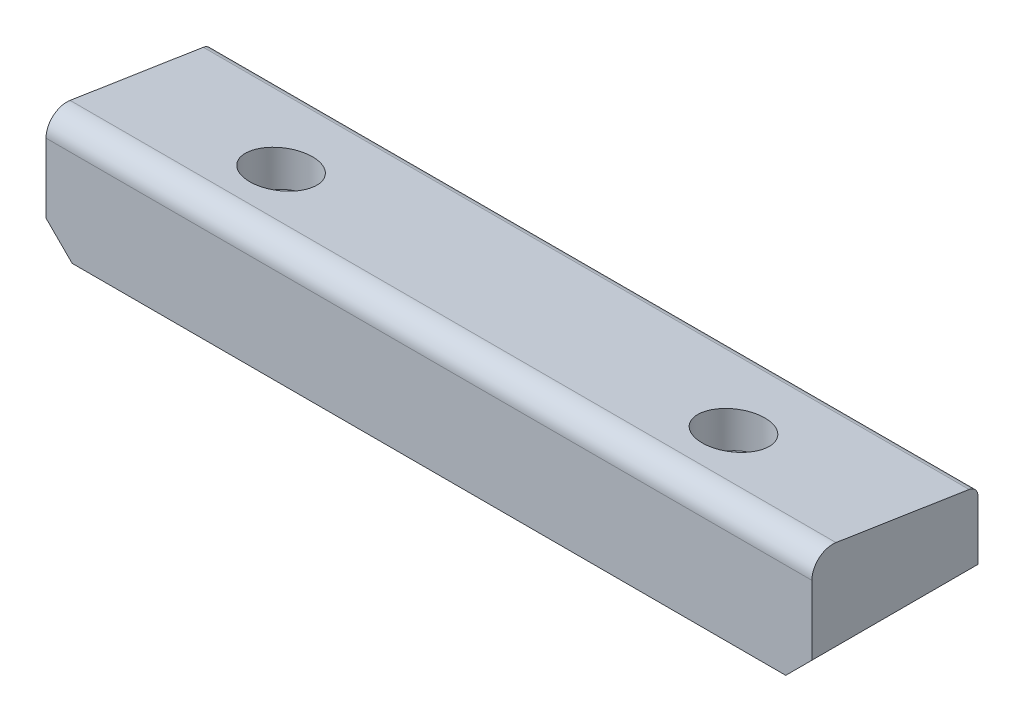
ISO-10303-21;
HEADER;
FILE_DESCRIPTION(('STEP AP214'),'2;1');
FILE_NAME('part.step','',(''),(''),'','','');
FILE_SCHEMA(('AUTOMOTIVE_DESIGN { 1 0 10303 214 1 1 1 1 }'));
ENDSEC;
DATA;
#1=APPLICATION_CONTEXT('core data for automotive mechanical design processes');
#2=APPLICATION_PROTOCOL_DEFINITION('international standard','automotive_design',2000,#1);
#3=PRODUCT_CONTEXT('',#1,'mechanical');
#4=PRODUCT('Part','Part','',(#3));
#5=PRODUCT_RELATED_PRODUCT_CATEGORY('part','',(#4));
#6=PRODUCT_DEFINITION_FORMATION('','',#4);
#7=PRODUCT_DEFINITION_CONTEXT('part definition',#1,'design');
#8=PRODUCT_DEFINITION('design','',#6,#7);
#9=PRODUCT_DEFINITION_SHAPE('','',#8);
#10=(LENGTH_UNIT() NAMED_UNIT(*) SI_UNIT(.MILLI.,.METRE.));
#11=(NAMED_UNIT(*) PLANE_ANGLE_UNIT() SI_UNIT($,.RADIAN.));
#12=(NAMED_UNIT(*) SI_UNIT($,.STERADIAN.) SOLID_ANGLE_UNIT());
#13=UNCERTAINTY_MEASURE_WITH_UNIT(LENGTH_MEASURE(1.E-05),#10,'distance_accuracy_value','');
#14=(GEOMETRIC_REPRESENTATION_CONTEXT(3) GLOBAL_UNCERTAINTY_ASSIGNED_CONTEXT((#13)) GLOBAL_UNIT_ASSIGNED_CONTEXT((#10,
#11,#12)) REPRESENTATION_CONTEXT('',''));
#15=CARTESIAN_POINT('',(0.,0.,0.));
#16=DIRECTION('',(0.,0.,1.));
#17=DIRECTION('',(1.,0.,0.));
#18=AXIS2_PLACEMENT_3D('',#15,#16,#17);
#19=CARTESIAN_POINT('',(36.65,5.73063892415449,9.55));
#20=DIRECTION('',(1.,0.,0.));
#21=DIRECTION('',(0.,1.,0.));
#22=AXIS2_PLACEMENT_3D('',#19,#20,#21);
#23=PLANE('',#22);
#24=DIRECTION('',(0.,0.,1.));
#25=VECTOR('',#24,1.);
#26=CARTESIAN_POINT('',(36.65,2.5,13.525));
#27=LINE('',#26,#25);
#28=CARTESIAN_POINT('',(36.65,2.5,1.6));
#29=VERTEX_POINT('',#28);
#30=CARTESIAN_POINT('',(36.65,2.5,17.5));
#31=VERTEX_POINT('',#30);
#32=EDGE_CURVE('E163',#29,#31,#27,.T.);
#33=ORIENTED_EDGE('',*,*,#32,.F.);
#34=DIRECTION('',(0.,1.,0.));
#35=VECTOR('',#34,1.);
#36=CARTESIAN_POINT('',(36.65,0.,1.6));
#37=LINE('',#36,#35);
#38=CARTESIAN_POINT('',(36.65,8.1447868426118,1.6));
#39=VERTEX_POINT('',#38);
#40=EDGE_CURVE('E160',#29,#39,#37,.T.);
#41=ORIENTED_EDGE('',*,*,#40,.T.);
#42=CARTESIAN_POINT('',(36.65,8.1447868426118,2.6));
#43=DIRECTION('',(-1.,0.,0.));
#44=DIRECTION('',(0.,0.650825020832891,-0.759227760463135));
#45=AXIS2_PLACEMENT_3D('',#42,#43,#44);
#46=CIRCLE('',#45,1.);
#47=CARTESIAN_POINT('',(36.65,9.13303568865246,2.44714641548425));
#48=VERTEX_POINT('',#47);
#49=EDGE_CURVE('E278',#48,#39,#46,.T.);
#50=ORIENTED_EDGE('',*,*,#49,.F.);
#51=DIRECTION('',(0.,0.152853584515735,0.988248846040657));
#52=VECTOR('',#51,1.);
#53=CARTESIAN_POINT('',(36.65,9.00200657919767,1.6));
#54=LINE('',#53,#52);
#55=CARTESIAN_POINT('',(36.65,11.1046514712157,15.1942928309685));
#56=VERTEX_POINT('',#55);
#57=EDGE_CURVE('E247',#48,#56,#54,.T.);
#58=ORIENTED_EDGE('',*,*,#57,.T.);
#59=CARTESIAN_POINT('',(36.65,9.12815377913439,15.5));
#60=DIRECTION('',(-1.,0.,0.));
#61=DIRECTION('',(0.,0.759227760463135,0.650825020832891));
#62=AXIS2_PLACEMENT_3D('',#59,#60,#61);
#63=CIRCLE('',#62,2.);
#64=CARTESIAN_POINT('',(36.65,9.12815377913439,17.5));
#65=VERTEX_POINT('',#64);
#66=EDGE_CURVE('E222',#65,#56,#63,.T.);
#67=ORIENTED_EDGE('',*,*,#66,.F.);
#68=DIRECTION('',(0.,-1.,0.));
#69=VECTOR('',#68,1.);
#70=CARTESIAN_POINT('',(36.65,0.,17.5));
#71=LINE('',#70,#69);
#72=EDGE_CURVE('E37',#65,#31,#71,.T.);
#73=ORIENTED_EDGE('',*,*,#72,.T.);
#74=EDGE_LOOP('',(#33,#41,#50,#58,#67,#73));
#75=FACE_BOUND('',#74,.T.);
#76=ADVANCED_FACE('F17',(#75),#23,.T.);
#77=CARTESIAN_POINT('',(21.65,50.,10.));
#78=DIRECTION('',(0.,1.,0.));
#79=DIRECTION('',(0.,0.,-1.));
#80=AXIS2_PLACEMENT_3D('',#77,#78,#79);
#81=CYLINDRICAL_SURFACE('',#80,1.6);
#82=CARTESIAN_POINT('',(21.65,6.5,10.));
#83=DIRECTION('',(0.,1.,0.));
#84=DIRECTION('',(0.,0.,-1.));
#85=AXIS2_PLACEMENT_3D('',#82,#83,#84);
#86=CIRCLE('',#85,1.6);
#87=CARTESIAN_POINT('',(21.65,6.5,8.4));
#88=VERTEX_POINT('',#87);
#89=EDGE_CURVE('E11',#88,#88,#86,.T.);
#90=ORIENTED_EDGE('',*,*,#89,.T.);
#91=EDGE_LOOP('',(#90));
#92=FACE_BOUND('',#91,.T.);
#93=CARTESIAN_POINT('',(21.65,0.,10.));
#94=DIRECTION('',(0.,1.,0.));
#95=DIRECTION('',(0.,0.,-1.));
#96=AXIS2_PLACEMENT_3D('',#93,#94,#95);
#97=CIRCLE('',#96,1.6);
#98=CARTESIAN_POINT('',(21.65,0.,8.4));
#99=VERTEX_POINT('',#98);
#100=EDGE_CURVE('E242',#99,#99,#97,.T.);
#101=ORIENTED_EDGE('',*,*,#100,.F.);
#102=EDGE_LOOP('',(#101));
#103=FACE_BOUND('',#102,.T.);
#104=ADVANCED_FACE('F335',(#92,#103),#81,.F.);
#105=CARTESIAN_POINT('',(-21.65,50.,10.));
#106=DIRECTION('',(0.,1.,0.));
#107=DIRECTION('',(0.,0.,-1.));
#108=AXIS2_PLACEMENT_3D('',#105,#106,#107);
#109=CYLINDRICAL_SURFACE('',#108,1.6);
#110=CARTESIAN_POINT('',(-21.65,6.5,10.));
#111=DIRECTION('',(0.,1.,0.));
#112=DIRECTION('',(0.,0.,-1.));
#113=AXIS2_PLACEMENT_3D('',#110,#111,#112);
#114=CIRCLE('',#113,1.6);
#115=CARTESIAN_POINT('',(-21.65,6.5,8.4));
#116=VERTEX_POINT('',#115);
#117=EDGE_CURVE('E311',#116,#116,#114,.T.);
#118=ORIENTED_EDGE('',*,*,#117,.T.);
#119=EDGE_LOOP('',(#118));
#120=FACE_BOUND('',#119,.T.);
#121=CARTESIAN_POINT('',(-21.65,0.,10.));
#122=DIRECTION('',(0.,1.,0.));
#123=DIRECTION('',(0.,0.,-1.));
#124=AXIS2_PLACEMENT_3D('',#121,#122,#123);
#125=CIRCLE('',#124,1.6);
#126=CARTESIAN_POINT('',(-21.65,0.,8.4));
#127=VERTEX_POINT('',#126);
#128=EDGE_CURVE('E238',#127,#127,#125,.T.);
#129=ORIENTED_EDGE('',*,*,#128,.F.);
#130=EDGE_LOOP('',(#129));
#131=FACE_BOUND('',#130,.T.);
#132=ADVANCED_FACE('F324',(#120,#131),#109,.F.);
#133=CARTESIAN_POINT('',(21.65,6.5,10.));
#134=DIRECTION('',(0.,-1.,0.));
#135=DIRECTION('',(0.,0.,-1.));
#136=AXIS2_PLACEMENT_3D('',#133,#134,#135);
#137=PLANE('',#136);
#138=ORIENTED_EDGE('',*,*,#89,.F.);
#139=EDGE_LOOP('',(#138));
#140=FACE_BOUND('',#139,.T.);
#141=CARTESIAN_POINT('',(21.65,6.5,10.));
#142=DIRECTION('',(0.,-1.,0.));
#143=DIRECTION('',(1.,0.,0.));
#144=AXIS2_PLACEMENT_3D('',#141,#142,#143);
#145=CIRCLE('',#144,3.);
#146=CARTESIAN_POINT('',(24.65,6.5,10.));
#147=VERTEX_POINT('',#146);
#148=EDGE_CURVE('E25',#147,#147,#145,.T.);
#149=ORIENTED_EDGE('',*,*,#148,.F.);
#150=EDGE_LOOP('',(#149));
#151=FACE_BOUND('',#150,.T.);
#152=ADVANCED_FACE('F322',(#140,#151),#137,.F.);
#153=CARTESIAN_POINT('',(21.65,6.5,10.));
#154=DIRECTION('',(0.,1.,0.));
#155=DIRECTION('',(1.,0.,0.));
#156=AXIS2_PLACEMENT_3D('',#153,#154,#155);
#157=CYLINDRICAL_SURFACE('',#156,3.);
#158=CARTESIAN_POINT('',(21.65,10.3012442308036,10.));
#159=DIRECTION('',(0.,-0.988248846040657,0.152853584515735));
#160=DIRECTION('',(0.,-0.152853584515735,-0.988248846040657));
#161=AXIS2_PLACEMENT_3D('',#158,#159,#160);
#162=ELLIPSE('',#161,3.03567265675975,3.);
#163=CARTESIAN_POINT('',(21.65,9.83723078380147,7.));
#164=VERTEX_POINT('',#163);
#165=EDGE_CURVE('E289',#164,#164,#162,.T.);
#166=ORIENTED_EDGE('',*,*,#165,.F.);
#167=EDGE_LOOP('',(#166));
#168=FACE_BOUND('',#167,.T.);
#169=ORIENTED_EDGE('',*,*,#148,.T.);
#170=EDGE_LOOP('',(#169));
#171=FACE_BOUND('',#170,.T.);
#172=ADVANCED_FACE('F320',(#168,#171),#157,.F.);
#173=CARTESIAN_POINT('',(-21.65,6.5,10.));
#174=DIRECTION('',(0.,-1.,0.));
#175=DIRECTION('',(0.,0.,-1.));
#176=AXIS2_PLACEMENT_3D('',#173,#174,#175);
#177=PLANE('',#176);
#178=ORIENTED_EDGE('',*,*,#117,.F.);
#179=EDGE_LOOP('',(#178));
#180=FACE_BOUND('',#179,.T.);
#181=CARTESIAN_POINT('',(-21.65,6.5,10.));
#182=DIRECTION('',(0.,-1.,0.));
#183=DIRECTION('',(1.,0.,0.));
#184=AXIS2_PLACEMENT_3D('',#181,#182,#183);
#185=CIRCLE('',#184,3.);
#186=CARTESIAN_POINT('',(-18.65,6.5,10.));
#187=VERTEX_POINT('',#186);
#188=EDGE_CURVE('E307',#187,#187,#185,.T.);
#189=ORIENTED_EDGE('',*,*,#188,.F.);
#190=EDGE_LOOP('',(#189));
#191=FACE_BOUND('',#190,.T.);
#192=ADVANCED_FACE('F332',(#180,#191),#177,.F.);
#193=CARTESIAN_POINT('',(-21.65,6.5,10.));
#194=DIRECTION('',(0.,1.,0.));
#195=DIRECTION('',(1.,0.,0.));
#196=AXIS2_PLACEMENT_3D('',#193,#194,#195);
#197=CYLINDRICAL_SURFACE('',#196,3.);
#198=CARTESIAN_POINT('',(-21.65,10.3012442308036,10.));
#199=DIRECTION('',(0.,-0.988248846040657,0.152853584515735));
#200=DIRECTION('',(0.,-0.152853584515735,-0.988248846040657));
#201=AXIS2_PLACEMENT_3D('',#198,#199,#200);
#202=ELLIPSE('',#201,3.03567265675975,3.);
#203=CARTESIAN_POINT('',(-21.65,9.83723078380147,7.));
#204=VERTEX_POINT('',#203);
#205=EDGE_CURVE('E293',#204,#204,#202,.T.);
#206=ORIENTED_EDGE('',*,*,#205,.F.);
#207=EDGE_LOOP('',(#206));
#208=FACE_BOUND('',#207,.T.);
#209=ORIENTED_EDGE('',*,*,#188,.T.);
#210=EDGE_LOOP('',(#209));
#211=FACE_BOUND('',#210,.T.);
#212=ADVANCED_FACE('F410',(#208,#211),#197,.F.);
#213=CARTESIAN_POINT('',(0.,11.461277848309,17.5));
#214=DIRECTION('',(0.,0.,1.));
#215=DIRECTION('',(1.,0.,0.));
#216=AXIS2_PLACEMENT_3D('',#213,#214,#215);
#217=PLANE('',#216);
#218=DIRECTION('',(-0.707106781186548,-0.707106781186548,0.));
#219=VECTOR('',#218,1.);
#220=CARTESIAN_POINT('',(29.1028194620772,-5.04718053792275,17.5));
#221=LINE('',#220,#219);
#222=CARTESIAN_POINT('',(34.15,0.,17.5));
#223=VERTEX_POINT('',#222);
#224=EDGE_CURVE('E154',#31,#223,#221,.T.);
#225=ORIENTED_EDGE('',*,*,#224,.F.);
#226=ORIENTED_EDGE('',*,*,#72,.F.);
#227=DIRECTION('',(1.,0.,0.));
#228=VECTOR('',#227,1.);
#229=CARTESIAN_POINT('',(0.,9.12815377913439,17.5));
#230=LINE('',#229,#228);
#231=CARTESIAN_POINT('',(-36.65,9.12815377913439,17.5));
#232=VERTEX_POINT('',#231);
#233=EDGE_CURVE('E43',#232,#65,#230,.T.);
#234=ORIENTED_EDGE('',*,*,#233,.F.);
#235=DIRECTION('',(0.,1.,0.));
#236=VECTOR('',#235,1.);
#237=CARTESIAN_POINT('',(-36.65,0.,17.5));
#238=LINE('',#237,#236);
#239=CARTESIAN_POINT('',(-36.65,2.5,17.5));
#240=VERTEX_POINT('',#239);
#241=EDGE_CURVE('E297',#240,#232,#238,.T.);
#242=ORIENTED_EDGE('',*,*,#241,.F.);
#243=DIRECTION('',(-0.707106781186548,0.707106781186548,0.));
#244=VECTOR('',#243,1.);
#245=CARTESIAN_POINT('',(-29.1028194620772,-5.04718053792275,17.5));
#246=LINE('',#245,#244);
#247=CARTESIAN_POINT('',(-34.15,0.,17.5));
#248=VERTEX_POINT('',#247);
#249=EDGE_CURVE('E258',#248,#240,#246,.T.);
#250=ORIENTED_EDGE('',*,*,#249,.F.);
#251=DIRECTION('',(-1.,0.,0.));
#252=VECTOR('',#251,1.);
#253=CARTESIAN_POINT('',(0.,0.,17.5));
#254=LINE('',#253,#252);
#255=EDGE_CURVE('E214',#223,#248,#254,.T.);
#256=ORIENTED_EDGE('',*,*,#255,.F.);
#257=EDGE_LOOP('',(#225,#226,#234,#242,#250,#256));
#258=FACE_BOUND('',#257,.T.);
#259=ADVANCED_FACE('F347',(#258),#217,.T.);
#260=CARTESIAN_POINT('',(0.,9.12815377913439,15.5));
#261=DIRECTION('',(1.,0.,0.));
#262=DIRECTION('',(0.,0.759227760463135,0.650825020832891));
#263=AXIS2_PLACEMENT_3D('',#260,#261,#262);
#264=CYLINDRICAL_SURFACE('',#263,2.);
#265=ORIENTED_EDGE('',*,*,#66,.T.);
#266=DIRECTION('',(-1.,0.,0.));
#267=VECTOR('',#266,1.);
#268=CARTESIAN_POINT('',(0.,11.1046514712157,15.1942928309685));
#269=LINE('',#268,#267);
#270=CARTESIAN_POINT('',(-36.65,11.1046514712157,15.1942928309685));
#271=VERTEX_POINT('',#270);
#272=EDGE_CURVE('E243',#56,#271,#269,.T.);
#273=ORIENTED_EDGE('',*,*,#272,.T.);
#274=CARTESIAN_POINT('',(-36.65,9.12815377913439,15.5));
#275=DIRECTION('',(1.,0.,0.));
#276=DIRECTION('',(0.,0.759227760463135,0.650825020832891));
#277=AXIS2_PLACEMENT_3D('',#274,#275,#276);
#278=CIRCLE('',#277,2.);
#279=EDGE_CURVE('E225',#271,#232,#278,.T.);
#280=ORIENTED_EDGE('',*,*,#279,.T.);
#281=ORIENTED_EDGE('',*,*,#233,.T.);
#282=EDGE_LOOP('',(#265,#273,#280,#281));
#283=FACE_BOUND('',#282,.T.);
#284=ADVANCED_FACE('F388',(#283),#264,.T.);
#285=CARTESIAN_POINT('',(-36.65,5.73063892415449,9.55));
#286=DIRECTION('',(-1.,0.,0.));
#287=DIRECTION('',(0.,0.,1.));
#288=AXIS2_PLACEMENT_3D('',#285,#286,#287);
#289=PLANE('',#288);
#290=DIRECTION('',(0.,0.,-1.));
#291=VECTOR('',#290,1.);
#292=CARTESIAN_POINT('',(-36.65,2.5,13.525));
#293=LINE('',#292,#291);
#294=CARTESIAN_POINT('',(-36.65,2.5,1.6));
#295=VERTEX_POINT('',#294);
#296=EDGE_CURVE('E254',#240,#295,#293,.T.);
#297=ORIENTED_EDGE('',*,*,#296,.F.);
#298=ORIENTED_EDGE('',*,*,#241,.T.);
#299=ORIENTED_EDGE('',*,*,#279,.F.);
#300=DIRECTION('',(0.,-0.152853584515735,-0.988248846040657));
#301=VECTOR('',#300,1.);
#302=CARTESIAN_POINT('',(-36.65,9.00200657919767,1.6));
#303=LINE('',#302,#301);
#304=CARTESIAN_POINT('',(-36.65,9.13303568865246,2.44714641548425));
#305=VERTEX_POINT('',#304);
#306=EDGE_CURVE('E248',#271,#305,#303,.T.);
#307=ORIENTED_EDGE('',*,*,#306,.T.);
#308=CARTESIAN_POINT('',(-36.65,8.1447868426118,2.6));
#309=DIRECTION('',(1.,0.,0.));
#310=DIRECTION('',(0.,0.650825020832891,-0.759227760463135));
#311=AXIS2_PLACEMENT_3D('',#308,#309,#310);
#312=CIRCLE('',#311,1.);
#313=CARTESIAN_POINT('',(-36.65,8.1447868426118,1.6));
#314=VERTEX_POINT('',#313);
#315=EDGE_CURVE('E272',#314,#305,#312,.T.);
#316=ORIENTED_EDGE('',*,*,#315,.F.);
#317=DIRECTION('',(0.,-1.,0.));
#318=VECTOR('',#317,1.);
#319=CARTESIAN_POINT('',(-36.65,0.,1.6));
#320=LINE('',#319,#318);
#321=EDGE_CURVE('E204',#314,#295,#320,.T.);
#322=ORIENTED_EDGE('',*,*,#321,.T.);
#323=EDGE_LOOP('',(#297,#298,#299,#307,#316,#322));
#324=FACE_BOUND('',#323,.T.);
#325=ADVANCED_FACE('F384',(#324),#289,.T.);
#326=CARTESIAN_POINT('',(0.,9.00200657919767,1.6));
#327=DIRECTION('',(0.,0.988248846040657,-0.152853584515735));
#328=DIRECTION('',(-1.,0.,0.));
#329=AXIS2_PLACEMENT_3D('',#326,#327,#328);
#330=PLANE('',#329);
#331=ORIENTED_EDGE('',*,*,#205,.T.);
#332=EDGE_LOOP('',(#331));
#333=FACE_BOUND('',#332,.T.);
#334=ORIENTED_EDGE('',*,*,#165,.T.);
#335=EDGE_LOOP('',(#334));
#336=FACE_BOUND('',#335,.T.);
#337=DIRECTION('',(1.,0.,0.));
#338=VECTOR('',#337,1.);
#339=CARTESIAN_POINT('',(0.,9.13303568865246,2.44714641548425));
#340=LINE('',#339,#338);
#341=EDGE_CURVE('E268',#305,#48,#340,.T.);
#342=ORIENTED_EDGE('',*,*,#341,.F.);
#343=ORIENTED_EDGE('',*,*,#306,.F.);
#344=ORIENTED_EDGE('',*,*,#272,.F.);
#345=ORIENTED_EDGE('',*,*,#57,.F.);
#346=EDGE_LOOP('',(#342,#343,#344,#345));
#347=FACE_BOUND('',#346,.T.);
#348=ADVANCED_FACE('F387',(#333,#336,#347),#330,.T.);
#349=CARTESIAN_POINT('',(0.,8.1447868426118,2.6));
#350=DIRECTION('',(1.,0.,0.));
#351=DIRECTION('',(0.,0.650825020832891,-0.759227760463135));
#352=AXIS2_PLACEMENT_3D('',#349,#350,#351);
#353=CYLINDRICAL_SURFACE('',#352,1.);
#354=ORIENTED_EDGE('',*,*,#49,.T.);
#355=DIRECTION('',(-1.,0.,0.));
#356=VECTOR('',#355,1.);
#357=CARTESIAN_POINT('',(0.,8.1447868426118,1.6));
#358=LINE('',#357,#356);
#359=EDGE_CURVE('E208',#39,#314,#358,.T.);
#360=ORIENTED_EDGE('',*,*,#359,.T.);
#361=ORIENTED_EDGE('',*,*,#315,.T.);
#362=ORIENTED_EDGE('',*,*,#341,.T.);
#363=EDGE_LOOP('',(#354,#360,#361,#362));
#364=FACE_BOUND('',#363,.T.);
#365=ADVANCED_FACE('F398',(#364),#353,.T.);
#366=CARTESIAN_POINT('',(-13.5,0.,0.));
#367=DIRECTION('',(0.,1.,0.));
#368=DIRECTION('',(1.,0.,0.));
#369=AXIS2_PLACEMENT_3D('',#366,#367,#368);
#370=CYLINDRICAL_SURFACE('',#369,3.);
#371=DIRECTION('',(0.,1.,0.));
#372=VECTOR('',#371,1.);
#373=CARTESIAN_POINT('',(-10.9622844919101,0.,1.6));
#374=LINE('',#373,#372);
#375=CARTESIAN_POINT('',(-10.9622844919101,0.,1.6));
#376=VERTEX_POINT('',#375);
#377=CARTESIAN_POINT('',(-10.9622844919101,3.,1.6));
#378=VERTEX_POINT('',#377);
#379=EDGE_CURVE('E180',#376,#378,#374,.T.);
#380=ORIENTED_EDGE('',*,*,#379,.F.);
#381=CARTESIAN_POINT('',(-13.5,0.,0.));
#382=DIRECTION('',(0.,1.,0.));
#383=DIRECTION('',(1.,0.,0.));
#384=AXIS2_PLACEMENT_3D('',#381,#382,#383);
#385=CIRCLE('',#384,3.);
#386=CARTESIAN_POINT('',(-16.0377155080899,0.,1.6));
#387=VERTEX_POINT('',#386);
#388=EDGE_CURVE('E221',#387,#376,#385,.T.);
#389=ORIENTED_EDGE('',*,*,#388,.F.);
#390=DIRECTION('',(0.,-1.,0.));
#391=VECTOR('',#390,1.);
#392=CARTESIAN_POINT('',(-16.0377155080899,0.,1.6));
#393=LINE('',#392,#391);
#394=CARTESIAN_POINT('',(-16.0377155080899,3.,1.6));
#395=VERTEX_POINT('',#394);
#396=EDGE_CURVE('E179',#395,#387,#393,.T.);
#397=ORIENTED_EDGE('',*,*,#396,.F.);
#398=CARTESIAN_POINT('',(-13.5,3.,0.));
#399=DIRECTION('',(0.,1.,0.));
#400=DIRECTION('',(1.,0.,0.));
#401=AXIS2_PLACEMENT_3D('',#398,#399,#400);
#402=CIRCLE('',#401,3.);
#403=EDGE_CURVE('E275',#395,#378,#402,.T.);
#404=ORIENTED_EDGE('',*,*,#403,.T.);
#405=EDGE_LOOP('',(#380,#389,#397,#404));
#406=FACE_BOUND('',#405,.T.);
#407=ADVANCED_FACE('F360',(#406),#370,.F.);
#408=CARTESIAN_POINT('',(-13.5,3.,0.));
#409=DIRECTION('',(0.,-1.,0.));
#410=DIRECTION('',(0.,0.,-1.));
#411=AXIS2_PLACEMENT_3D('',#408,#409,#410);
#412=PLANE('',#411);
#413=DIRECTION('',(-1.,0.,0.));
#414=VECTOR('',#413,1.);
#415=CARTESIAN_POINT('',(-6.75,3.,1.6));
#416=LINE('',#415,#414);
#417=EDGE_CURVE('E175',#378,#395,#416,.T.);
#418=ORIENTED_EDGE('',*,*,#417,.F.);
#419=ORIENTED_EDGE('',*,*,#403,.F.);
#420=EDGE_LOOP('',(#418,#419));
#421=FACE_BOUND('',#420,.T.);
#422=ADVANCED_FACE('F378',(#421),#412,.T.);
#423=CARTESIAN_POINT('',(13.5,0.,0.));
#424=DIRECTION('',(0.,1.,0.));
#425=DIRECTION('',(1.,0.,0.));
#426=AXIS2_PLACEMENT_3D('',#423,#424,#425);
#427=CYLINDRICAL_SURFACE('',#426,3.);
#428=DIRECTION('',(0.,1.,0.));
#429=VECTOR('',#428,1.);
#430=CARTESIAN_POINT('',(16.0377155080899,0.,1.6));
#431=LINE('',#430,#429);
#432=CARTESIAN_POINT('',(16.0377155080899,0.,1.6));
#433=VERTEX_POINT('',#432);
#434=CARTESIAN_POINT('',(16.0377155080899,3.,1.6));
#435=VERTEX_POINT('',#434);
#436=EDGE_CURVE('E147',#433,#435,#431,.T.);
#437=ORIENTED_EDGE('',*,*,#436,.F.);
#438=CARTESIAN_POINT('',(13.5,0.,0.));
#439=DIRECTION('',(0.,1.,0.));
#440=DIRECTION('',(1.,0.,0.));
#441=AXIS2_PLACEMENT_3D('',#438,#439,#440);
#442=CIRCLE('',#441,3.);
#443=CARTESIAN_POINT('',(10.9622844919101,0.,1.6));
#444=VERTEX_POINT('',#443);
#445=EDGE_CURVE('E141',#444,#433,#442,.T.);
#446=ORIENTED_EDGE('',*,*,#445,.F.);
#447=DIRECTION('',(0.,-1.,0.));
#448=VECTOR('',#447,1.);
#449=CARTESIAN_POINT('',(10.9622844919101,0.,1.6));
#450=LINE('',#449,#448);
#451=CARTESIAN_POINT('',(10.9622844919101,3.,1.6));
#452=VERTEX_POINT('',#451);
#453=EDGE_CURVE('E184',#452,#444,#450,.T.);
#454=ORIENTED_EDGE('',*,*,#453,.F.);
#455=CARTESIAN_POINT('',(13.5,3.,0.));
#456=DIRECTION('',(0.,1.,0.));
#457=DIRECTION('',(1.,0.,0.));
#458=AXIS2_PLACEMENT_3D('',#455,#456,#457);
#459=CIRCLE('',#458,3.);
#460=EDGE_CURVE('E265',#452,#435,#459,.T.);
#461=ORIENTED_EDGE('',*,*,#460,.T.);
#462=EDGE_LOOP('',(#437,#446,#454,#461));
#463=FACE_BOUND('',#462,.T.);
#464=ADVANCED_FACE('F365',(#463),#427,.F.);
#465=CARTESIAN_POINT('',(13.5,3.,0.));
#466=DIRECTION('',(0.,-1.,0.));
#467=DIRECTION('',(0.,0.,-1.));
#468=AXIS2_PLACEMENT_3D('',#465,#466,#467);
#469=PLANE('',#468);
#470=DIRECTION('',(-1.,0.,0.));
#471=VECTOR('',#470,1.);
#472=CARTESIAN_POINT('',(6.75,3.,1.6));
#473=LINE('',#472,#471);
#474=EDGE_CURVE('E181',#435,#452,#473,.T.);
#475=ORIENTED_EDGE('',*,*,#474,.F.);
#476=ORIENTED_EDGE('',*,*,#460,.F.);
#477=EDGE_LOOP('',(#475,#476));
#478=FACE_BOUND('',#477,.T.);
#479=ADVANCED_FACE('F367',(#478),#469,.T.);
#480=CARTESIAN_POINT('',(-6.75,3.,11.6913429510899));
#481=DIRECTION('',(0.,-1.,0.));
#482=DIRECTION('',(0.,0.,-1.));
#483=AXIS2_PLACEMENT_3D('',#480,#481,#482);
#484=PLANE('',#483);
#485=CARTESIAN_POINT('',(-6.75,3.,11.6913429510899));
#486=DIRECTION('',(0.,1.,0.));
#487=DIRECTION('',(1.,0.,0.));
#488=AXIS2_PLACEMENT_3D('',#485,#486,#487);
#489=CIRCLE('',#488,3.);
#490=CARTESIAN_POINT('',(-3.75,3.,11.6913429510899));
#491=VERTEX_POINT('',#490);
#492=EDGE_CURVE('E253',#491,#491,#489,.T.);
#493=ORIENTED_EDGE('',*,*,#492,.F.);
#494=EDGE_LOOP('',(#493));
#495=FACE_BOUND('',#494,.T.);
#496=ADVANCED_FACE('F369',(#495),#484,.T.);
#497=CARTESIAN_POINT('',(-6.75,0.,11.6913429510899));
#498=DIRECTION('',(0.,1.,0.));
#499=DIRECTION('',(1.,0.,0.));
#500=AXIS2_PLACEMENT_3D('',#497,#498,#499);
#501=CYLINDRICAL_SURFACE('',#500,3.);
#502=ORIENTED_EDGE('',*,*,#492,.T.);
#503=EDGE_LOOP('',(#502));
#504=FACE_BOUND('',#503,.T.);
#505=CARTESIAN_POINT('',(-6.75,0.,11.6913429510899));
#506=DIRECTION('',(0.,1.,0.));
#507=DIRECTION('',(1.,0.,0.));
#508=AXIS2_PLACEMENT_3D('',#505,#506,#507);
#509=CIRCLE('',#508,3.);
#510=CARTESIAN_POINT('',(-3.75,0.,11.6913429510899));
#511=VERTEX_POINT('',#510);
#512=EDGE_CURVE('E234',#511,#511,#509,.T.);
#513=ORIENTED_EDGE('',*,*,#512,.F.);
#514=EDGE_LOOP('',(#513));
#515=FACE_BOUND('',#514,.T.);
#516=ADVANCED_FACE('F375',(#504,#515),#501,.F.);
#517=CARTESIAN_POINT('',(6.75,3.,11.6913429510899));
#518=DIRECTION('',(0.,-1.,0.));
#519=DIRECTION('',(0.,0.,-1.));
#520=AXIS2_PLACEMENT_3D('',#517,#518,#519);
#521=PLANE('',#520);
#522=CARTESIAN_POINT('',(6.75,3.,11.6913429510899));
#523=DIRECTION('',(0.,1.,0.));
#524=DIRECTION('',(1.,0.,0.));
#525=AXIS2_PLACEMENT_3D('',#522,#523,#524);
#526=CIRCLE('',#525,3.);
#527=CARTESIAN_POINT('',(9.75,3.,11.6913429510899));
#528=VERTEX_POINT('',#527);
#529=EDGE_CURVE('E249',#528,#528,#526,.T.);
#530=ORIENTED_EDGE('',*,*,#529,.F.);
#531=EDGE_LOOP('',(#530));
#532=FACE_BOUND('',#531,.T.);
#533=ADVANCED_FACE('F382',(#532),#521,.T.);
#534=CARTESIAN_POINT('',(6.75,0.,11.6913429510899));
#535=DIRECTION('',(0.,1.,0.));
#536=DIRECTION('',(1.,0.,0.));
#537=AXIS2_PLACEMENT_3D('',#534,#535,#536);
#538=CYLINDRICAL_SURFACE('',#537,3.);
#539=ORIENTED_EDGE('',*,*,#529,.T.);
#540=EDGE_LOOP('',(#539));
#541=FACE_BOUND('',#540,.T.);
#542=CARTESIAN_POINT('',(6.75,0.,11.6913429510899));
#543=DIRECTION('',(0.,1.,0.));
#544=DIRECTION('',(1.,0.,0.));
#545=AXIS2_PLACEMENT_3D('',#542,#543,#544);
#546=CIRCLE('',#545,3.);
#547=CARTESIAN_POINT('',(9.75,0.,11.6913429510899));
#548=VERTEX_POINT('',#547);
#549=EDGE_CURVE('E230',#548,#548,#546,.T.);
#550=ORIENTED_EDGE('',*,*,#549,.F.);
#551=EDGE_LOOP('',(#550));
#552=FACE_BOUND('',#551,.T.);
#553=ADVANCED_FACE('F433',(#541,#552),#538,.F.);
#554=CARTESIAN_POINT('',(-35.4,1.25,13.525));
#555=DIRECTION('',(-0.707106781186548,-0.707106781186548,0.));
#556=DIRECTION('',(-0.707106781186548,0.707106781186548,0.));
#557=AXIS2_PLACEMENT_3D('',#554,#555,#556);
#558=PLANE('',#557);
#559=ORIENTED_EDGE('',*,*,#249,.T.);
#560=ORIENTED_EDGE('',*,*,#296,.T.);
#561=DIRECTION('',(0.707106781186548,-0.707106781186548,0.));
#562=VECTOR('',#561,1.);
#563=CARTESIAN_POINT('',(-26.2375,-7.9125,1.6));
#564=LINE('',#563,#562);
#565=CARTESIAN_POINT('',(-34.15,0.,1.6));
#566=VERTEX_POINT('',#565);
#567=EDGE_CURVE('E171',#295,#566,#564,.T.);
#568=ORIENTED_EDGE('',*,*,#567,.T.);
#569=DIRECTION('',(0.,0.,1.));
#570=VECTOR('',#569,1.);
#571=CARTESIAN_POINT('',(-34.15,0.,13.525));
#572=LINE('',#571,#570);
#573=EDGE_CURVE('E217',#566,#248,#572,.T.);
#574=ORIENTED_EDGE('',*,*,#573,.T.);
#575=EDGE_LOOP('',(#559,#560,#568,#574));
#576=FACE_BOUND('',#575,.T.);
#577=ADVANCED_FACE('F352',(#576),#558,.T.);
#578=CARTESIAN_POINT('',(0.,0.,17.5));
#579=DIRECTION('',(0.,-1.,0.));
#580=DIRECTION('',(0.,0.,-1.));
#581=AXIS2_PLACEMENT_3D('',#578,#579,#580);
#582=PLANE('',#581);
#583=ORIENTED_EDGE('',*,*,#100,.T.);
#584=EDGE_LOOP('',(#583));
#585=FACE_BOUND('',#584,.T.);
#586=ORIENTED_EDGE('',*,*,#128,.T.);
#587=EDGE_LOOP('',(#586));
#588=FACE_BOUND('',#587,.T.);
#589=ORIENTED_EDGE('',*,*,#512,.T.);
#590=EDGE_LOOP('',(#589));
#591=FACE_BOUND('',#590,.T.);
#592=ORIENTED_EDGE('',*,*,#549,.T.);
#593=EDGE_LOOP('',(#592));
#594=FACE_BOUND('',#593,.T.);
#595=DIRECTION('',(0.,0.,-1.));
#596=VECTOR('',#595,1.);
#597=CARTESIAN_POINT('',(34.15,0.,13.525));
#598=LINE('',#597,#596);
#599=CARTESIAN_POINT('',(34.15,0.,1.6));
#600=VERTEX_POINT('',#599);
#601=EDGE_CURVE('E138',#223,#600,#598,.T.);
#602=ORIENTED_EDGE('',*,*,#601,.F.);
#603=ORIENTED_EDGE('',*,*,#255,.T.);
#604=ORIENTED_EDGE('',*,*,#573,.F.);
#605=DIRECTION('',(1.,0.,0.));
#606=VECTOR('',#605,1.);
#607=CARTESIAN_POINT('',(0.,0.,1.6));
#608=LINE('',#607,#606);
#609=EDGE_CURVE('E200',#566,#387,#608,.T.);
#610=ORIENTED_EDGE('',*,*,#609,.T.);
#611=ORIENTED_EDGE('',*,*,#388,.T.);
#612=DIRECTION('',(1.,0.,0.));
#613=VECTOR('',#612,1.);
#614=CARTESIAN_POINT('',(0.,0.,1.6));
#615=LINE('',#614,#613);
#616=EDGE_CURVE('E188',#376,#444,#615,.T.);
#617=ORIENTED_EDGE('',*,*,#616,.T.);
#618=ORIENTED_EDGE('',*,*,#445,.T.);
#619=DIRECTION('',(1.,0.,0.));
#620=VECTOR('',#619,1.);
#621=CARTESIAN_POINT('',(0.,0.,1.6));
#622=LINE('',#621,#620);
#623=EDGE_CURVE('E134',#433,#600,#622,.T.);
#624=ORIENTED_EDGE('',*,*,#623,.T.);
#625=EDGE_LOOP('',(#602,#603,#604,#610,#611,#617,#618,#624));
#626=FACE_BOUND('',#625,.T.);
#627=ADVANCED_FACE('F136',(#585,#588,#591,#594,#626),#582,.T.);
#628=CARTESIAN_POINT('',(0.,0.,1.6));
#629=DIRECTION('',(0.,0.,-1.));
#630=DIRECTION('',(0.,-1.,0.));
#631=AXIS2_PLACEMENT_3D('',#628,#629,#630);
#632=PLANE('',#631);
#633=DIRECTION('',(0.707106781186548,0.707106781186548,0.));
#634=VECTOR('',#633,1.);
#635=CARTESIAN_POINT('',(26.2375,-7.9125,1.6));
#636=LINE('',#635,#634);
#637=EDGE_CURVE('E153',#600,#29,#636,.T.);
#638=ORIENTED_EDGE('',*,*,#637,.F.);
#639=ORIENTED_EDGE('',*,*,#623,.F.);
#640=ORIENTED_EDGE('',*,*,#436,.T.);
#641=ORIENTED_EDGE('',*,*,#474,.T.);
#642=ORIENTED_EDGE('',*,*,#453,.T.);
#643=ORIENTED_EDGE('',*,*,#616,.F.);
#644=ORIENTED_EDGE('',*,*,#379,.T.);
#645=ORIENTED_EDGE('',*,*,#417,.T.);
#646=ORIENTED_EDGE('',*,*,#396,.T.);
#647=ORIENTED_EDGE('',*,*,#609,.F.);
#648=ORIENTED_EDGE('',*,*,#567,.F.);
#649=ORIENTED_EDGE('',*,*,#321,.F.);
#650=ORIENTED_EDGE('',*,*,#359,.F.);
#651=ORIENTED_EDGE('',*,*,#40,.F.);
#652=EDGE_LOOP('',(#638,#639,#640,#641,#642,#643,#644,#645,#646,#647,#648,#649,#650,#651));
#653=FACE_BOUND('',#652,.T.);
#654=ADVANCED_FACE('F157',(#653),#632,.T.);
#655=CARTESIAN_POINT('',(35.4,1.25,13.525));
#656=DIRECTION('',(0.707106781186548,-0.707106781186548,0.));
#657=DIRECTION('',(0.,0.,-1.));
#658=AXIS2_PLACEMENT_3D('',#655,#656,#657);
#659=PLANE('',#658);
#660=ORIENTED_EDGE('',*,*,#637,.T.);
#661=ORIENTED_EDGE('',*,*,#32,.T.);
#662=ORIENTED_EDGE('',*,*,#224,.T.);
#663=ORIENTED_EDGE('',*,*,#601,.T.);
#664=EDGE_LOOP('',(#660,#661,#662,#663));
#665=FACE_BOUND('',#664,.T.);
#666=ADVANCED_FACE('F151',(#665),#659,.T.);
#667=CLOSED_SHELL('',(#76,#104,#132,#152,#172,#192,#212,#259,#284,#325,#348,#365,#407,#422,#464,
#479,#496,#516,#533,#553,#577,#627,#654,#666));
#668=MANIFOLD_SOLID_BREP('B1',#667);
#669=ADVANCED_BREP_SHAPE_REPRESENTATION('',(#18,#668),#14);
#670=SHAPE_DEFINITION_REPRESENTATION(#9,#669);
ENDSEC;
END-ISO-10303-21;
